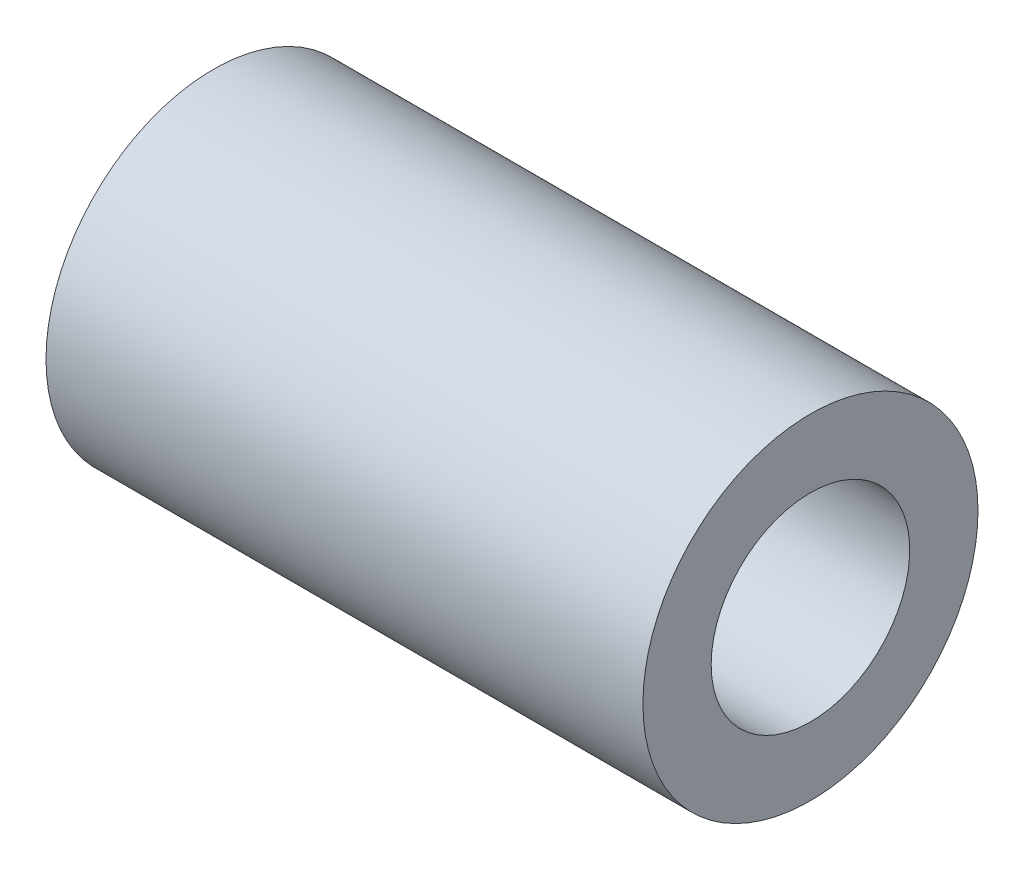
ISO-10303-21;
HEADER;
FILE_DESCRIPTION(('STEP AP214'),'2;1');
FILE_NAME('part.step','',(''),(''),'','','');
FILE_SCHEMA(('AUTOMOTIVE_DESIGN { 1 0 10303 214 1 1 1 1 }'));
ENDSEC;
DATA;
#1=APPLICATION_CONTEXT('core data for automotive mechanical design processes');
#2=APPLICATION_PROTOCOL_DEFINITION('international standard','automotive_design',2000,#1);
#3=PRODUCT_CONTEXT('',#1,'mechanical');
#4=PRODUCT('Part','Part','',(#3));
#5=PRODUCT_RELATED_PRODUCT_CATEGORY('part','',(#4));
#6=PRODUCT_DEFINITION_FORMATION('','',#4);
#7=PRODUCT_DEFINITION_CONTEXT('part definition',#1,'design');
#8=PRODUCT_DEFINITION('design','',#6,#7);
#9=PRODUCT_DEFINITION_SHAPE('','',#8);
#10=(LENGTH_UNIT() NAMED_UNIT(*) SI_UNIT(.MILLI.,.METRE.));
#11=(NAMED_UNIT(*) PLANE_ANGLE_UNIT() SI_UNIT($,.RADIAN.));
#12=(NAMED_UNIT(*) SI_UNIT($,.STERADIAN.) SOLID_ANGLE_UNIT());
#13=UNCERTAINTY_MEASURE_WITH_UNIT(LENGTH_MEASURE(1.E-05),#10,'distance_accuracy_value','');
#14=(GEOMETRIC_REPRESENTATION_CONTEXT(3) GLOBAL_UNCERTAINTY_ASSIGNED_CONTEXT((#13)) GLOBAL_UNIT_ASSIGNED_CONTEXT((#10,
#11,#12)) REPRESENTATION_CONTEXT('',''));
#15=CARTESIAN_POINT('',(0.,0.,0.));
#16=DIRECTION('',(0.,0.,1.));
#17=DIRECTION('',(1.,0.,0.));
#18=AXIS2_PLACEMENT_3D('',#15,#16,#17);
#19=CARTESIAN_POINT('',(96.2,0.,0.));
#20=DIRECTION('',(1.,0.,0.));
#21=DIRECTION('',(0.,0.,-1.));
#22=AXIS2_PLACEMENT_3D('',#19,#20,#21);
#23=PLANE('',#22);
#24=CARTESIAN_POINT('',(96.2,0.,0.));
#25=DIRECTION('',(1.,0.,0.));
#26=DIRECTION('',(0.,0.,-1.));
#27=AXIS2_PLACEMENT_3D('',#24,#25,#26);
#28=CIRCLE('',#27,27.);
#29=CARTESIAN_POINT('',(96.2,0.,27.));
#30=VERTEX_POINT('',#29);
#31=EDGE_CURVE('E10',#30,#30,#28,.T.);
#32=ORIENTED_EDGE('',*,*,#31,.T.);
#33=EDGE_LOOP('',(#32));
#34=FACE_BOUND('',#33,.T.);
#35=CARTESIAN_POINT('',(96.2,0.,0.));
#36=DIRECTION('',(1.,0.,0.));
#37=DIRECTION('',(0.,0.,-1.));
#38=AXIS2_PLACEMENT_3D('',#35,#36,#37);
#39=CIRCLE('',#38,16.);
#40=CARTESIAN_POINT('',(96.2,0.,16.));
#41=VERTEX_POINT('',#40);
#42=EDGE_CURVE('E50',#41,#41,#39,.T.);
#43=ORIENTED_EDGE('',*,*,#42,.F.);
#44=EDGE_LOOP('',(#43));
#45=FACE_BOUND('',#44,.T.);
#46=ADVANCED_FACE('F37',(#34,#45),#23,.T.);
#47=CARTESIAN_POINT('',(0.,0.,0.));
#48=DIRECTION('',(1.,0.,0.));
#49=DIRECTION('',(0.,0.,-1.));
#50=AXIS2_PLACEMENT_3D('',#47,#48,#49);
#51=PLANE('',#50);
#52=CARTESIAN_POINT('',(0.,0.,0.));
#53=DIRECTION('',(1.,0.,0.));
#54=DIRECTION('',(0.,0.,-1.));
#55=AXIS2_PLACEMENT_3D('',#52,#53,#54);
#56=CIRCLE('',#55,27.);
#57=CARTESIAN_POINT('',(0.,0.,27.));
#58=VERTEX_POINT('',#57);
#59=EDGE_CURVE('E41',#58,#58,#56,.T.);
#60=ORIENTED_EDGE('',*,*,#59,.F.);
#61=EDGE_LOOP('',(#60));
#62=FACE_BOUND('',#61,.T.);
#63=CARTESIAN_POINT('',(0.,0.,0.));
#64=DIRECTION('',(1.,0.,0.));
#65=DIRECTION('',(0.,0.,-1.));
#66=AXIS2_PLACEMENT_3D('',#63,#64,#65);
#67=CIRCLE('',#66,16.);
#68=CARTESIAN_POINT('',(0.,0.,16.));
#69=VERTEX_POINT('',#68);
#70=EDGE_CURVE('E52',#69,#69,#67,.T.);
#71=ORIENTED_EDGE('',*,*,#70,.T.);
#72=EDGE_LOOP('',(#71));
#73=FACE_BOUND('',#72,.T.);
#74=ADVANCED_FACE('F64',(#62,#73),#51,.F.);
#75=CARTESIAN_POINT('',(96.2,0.,0.));
#76=DIRECTION('',(-1.,0.,0.));
#77=DIRECTION('',(0.,0.,1.));
#78=AXIS2_PLACEMENT_3D('',#75,#76,#77);
#79=CYLINDRICAL_SURFACE('',#78,27.);
#80=CARTESIAN_POINT('',(96.2,0.,27.));
#81=CARTESIAN_POINT('',(95.1979166666667,0.,27.));
#82=CARTESIAN_POINT('',(94.1958333333333,0.,27.));
#83=CARTESIAN_POINT('',(92.1916666666667,0.,27.));
#84=CARTESIAN_POINT('',(91.1895833333333,0.,27.));
#85=CARTESIAN_POINT('',(89.1854166666667,0.,27.));
#86=CARTESIAN_POINT('',(88.1833333333333,0.,27.));
#87=CARTESIAN_POINT('',(86.1791666666667,0.,27.));
#88=CARTESIAN_POINT('',(85.1770833333333,0.,27.));
#89=CARTESIAN_POINT('',(83.1729166666667,0.,27.));
#90=CARTESIAN_POINT('',(82.1708333333333,0.,27.));
#91=CARTESIAN_POINT('',(80.1666666666667,0.,27.));
#92=CARTESIAN_POINT('',(79.1645833333333,0.,27.));
#93=CARTESIAN_POINT('',(77.1604166666667,0.,27.));
#94=CARTESIAN_POINT('',(76.1583333333333,0.,27.));
#95=CARTESIAN_POINT('',(74.1541666666667,0.,27.));
#96=CARTESIAN_POINT('',(73.1520833333333,0.,27.));
#97=CARTESIAN_POINT('',(71.1479166666667,0.,27.));
#98=CARTESIAN_POINT('',(70.1458333333333,0.,27.));
#99=CARTESIAN_POINT('',(68.1416666666667,0.,27.));
#100=CARTESIAN_POINT('',(67.1395833333333,0.,27.));
#101=CARTESIAN_POINT('',(65.1354166666667,0.,27.));
#102=CARTESIAN_POINT('',(64.1333333333333,0.,27.));
#103=CARTESIAN_POINT('',(62.1291666666667,0.,27.));
#104=CARTESIAN_POINT('',(61.1270833333333,0.,27.));
#105=CARTESIAN_POINT('',(59.1229166666667,0.,27.));
#106=CARTESIAN_POINT('',(58.1208333333333,0.,27.));
#107=CARTESIAN_POINT('',(56.1166666666667,0.,27.));
#108=CARTESIAN_POINT('',(55.1145833333333,0.,27.));
#109=CARTESIAN_POINT('',(53.1104166666667,0.,27.));
#110=CARTESIAN_POINT('',(52.1083333333333,0.,27.));
#111=CARTESIAN_POINT('',(50.1041666666667,0.,27.));
#112=CARTESIAN_POINT('',(49.1020833333333,0.,27.));
#113=CARTESIAN_POINT('',(47.0979166666667,0.,27.));
#114=CARTESIAN_POINT('',(46.0958333333333,0.,27.));
#115=CARTESIAN_POINT('',(44.0916666666667,0.,27.));
#116=CARTESIAN_POINT('',(43.0895833333333,0.,27.));
#117=CARTESIAN_POINT('',(41.0854166666667,0.,27.));
#118=CARTESIAN_POINT('',(40.0833333333333,0.,27.));
#119=CARTESIAN_POINT('',(38.0791666666667,0.,27.));
#120=CARTESIAN_POINT('',(37.0770833333333,0.,27.));
#121=CARTESIAN_POINT('',(35.0729166666667,0.,27.));
#122=CARTESIAN_POINT('',(34.0708333333333,0.,27.));
#123=CARTESIAN_POINT('',(32.0666666666667,0.,27.));
#124=CARTESIAN_POINT('',(31.0645833333333,0.,27.));
#125=CARTESIAN_POINT('',(29.0604166666667,0.,27.));
#126=CARTESIAN_POINT('',(28.0583333333333,0.,27.));
#127=CARTESIAN_POINT('',(26.0541666666667,0.,27.));
#128=CARTESIAN_POINT('',(25.0520833333333,0.,27.));
#129=CARTESIAN_POINT('',(23.0479166666667,0.,27.));
#130=CARTESIAN_POINT('',(22.0458333333333,0.,27.));
#131=CARTESIAN_POINT('',(20.0416666666667,0.,27.));
#132=CARTESIAN_POINT('',(19.0395833333333,0.,27.));
#133=CARTESIAN_POINT('',(17.0354166666667,0.,27.));
#134=CARTESIAN_POINT('',(16.0333333333333,0.,27.));
#135=CARTESIAN_POINT('',(14.0291666666667,0.,27.));
#136=CARTESIAN_POINT('',(13.0270833333333,0.,27.));
#137=CARTESIAN_POINT('',(11.0229166666667,0.,27.));
#138=CARTESIAN_POINT('',(10.0208333333333,0.,27.));
#139=CARTESIAN_POINT('',(8.01666666666666,0.,27.));
#140=CARTESIAN_POINT('',(7.01458333333332,0.,27.));
#141=CARTESIAN_POINT('',(5.01041666666666,0.,27.));
#142=CARTESIAN_POINT('',(4.00833333333332,0.,27.));
#143=CARTESIAN_POINT('',(2.00416666666665,0.,27.));
#144=CARTESIAN_POINT('',(1.00208333333332,0.,27.));
#145=CARTESIAN_POINT('',(0.,0.,27.));
#146=B_SPLINE_CURVE_WITH_KNOTS('',3,(#80,#81,#82,#83,#84,#85,#86,#87,#88,#89,#90,#91,#92,#93,
#94,#95,#96,#97,#98,#99,#100,#101,#102,#103,#104,#105,#106,#107,#108,#109,#110,#111,#112,#113,
#114,#115,#116,#117,#118,#119,#120,#121,#122,#123,#124,#125,#126,#127,#128,#129,#130,#131,#132,
#133,#134,#135,#136,#137,#138,#139,#140,#141,#142,#143,#144,#145),.UNSPECIFIED.,.F.,.F.,(4,2,2,
2,2,2,2,2,2,2,2,2,2,2,2,2,2,2,2,2,2,2,2,2,2,2,2,2,2,2,2,2,4),(0.,3.00625,6.0125,
9.01875000000001,12.025,15.03125,18.0375,21.04375,24.05,27.05625,30.0625,33.06875,36.075,
39.08125,42.0875,45.09375,48.1,51.10625,54.1125,57.11875,60.125,63.13125,66.1375,69.14375,72.15,
75.15625,78.1625,81.16875,84.175,87.18125,90.1875,93.19375,96.2),.UNSPECIFIED.);
#147=EDGE_CURVE('BSEAM39',#30,#58,#146,.T.);
#148=ORIENTED_EDGE('',*,*,#31,.F.);
#149=ORIENTED_EDGE('',*,*,#59,.T.);
#150=ORIENTED_EDGE('',*,*,#147,.T.);
#151=ORIENTED_EDGE('',*,*,#147,.F.);
#152=EDGE_LOOP('',(#148,#150,#149,#151));
#153=FACE_BOUND('',#152,.T.);
#154=ADVANCED_FACE('F39',(#153),#79,.T.);
#155=CARTESIAN_POINT('',(96.2,0.,0.));
#156=DIRECTION('',(-1.,0.,0.));
#157=DIRECTION('',(0.,0.,1.));
#158=AXIS2_PLACEMENT_3D('',#155,#156,#157);
#159=CYLINDRICAL_SURFACE('',#158,16.);
#160=CARTESIAN_POINT('',(96.2,0.,16.));
#161=CARTESIAN_POINT('',(95.1979166666667,0.,16.));
#162=CARTESIAN_POINT('',(94.1958333333333,0.,16.));
#163=CARTESIAN_POINT('',(92.1916666666667,0.,16.));
#164=CARTESIAN_POINT('',(91.1895833333333,0.,16.));
#165=CARTESIAN_POINT('',(89.1854166666667,0.,16.));
#166=CARTESIAN_POINT('',(88.1833333333333,0.,16.));
#167=CARTESIAN_POINT('',(86.1791666666667,0.,16.));
#168=CARTESIAN_POINT('',(85.1770833333333,0.,16.));
#169=CARTESIAN_POINT('',(83.1729166666667,0.,16.));
#170=CARTESIAN_POINT('',(82.1708333333333,0.,16.));
#171=CARTESIAN_POINT('',(80.1666666666667,0.,16.));
#172=CARTESIAN_POINT('',(79.1645833333333,0.,16.));
#173=CARTESIAN_POINT('',(77.1604166666667,0.,16.));
#174=CARTESIAN_POINT('',(76.1583333333333,0.,16.));
#175=CARTESIAN_POINT('',(74.1541666666667,0.,16.));
#176=CARTESIAN_POINT('',(73.1520833333333,0.,16.));
#177=CARTESIAN_POINT('',(71.1479166666667,0.,16.));
#178=CARTESIAN_POINT('',(70.1458333333333,0.,16.));
#179=CARTESIAN_POINT('',(68.1416666666667,0.,16.));
#180=CARTESIAN_POINT('',(67.1395833333333,0.,16.));
#181=CARTESIAN_POINT('',(65.1354166666667,0.,16.));
#182=CARTESIAN_POINT('',(64.1333333333333,0.,16.));
#183=CARTESIAN_POINT('',(62.1291666666667,0.,16.));
#184=CARTESIAN_POINT('',(61.1270833333333,0.,16.));
#185=CARTESIAN_POINT('',(59.1229166666667,0.,16.));
#186=CARTESIAN_POINT('',(58.1208333333333,0.,16.));
#187=CARTESIAN_POINT('',(56.1166666666667,0.,16.));
#188=CARTESIAN_POINT('',(55.1145833333333,0.,16.));
#189=CARTESIAN_POINT('',(53.1104166666667,0.,16.));
#190=CARTESIAN_POINT('',(52.1083333333333,0.,16.));
#191=CARTESIAN_POINT('',(50.1041666666667,0.,16.));
#192=CARTESIAN_POINT('',(49.1020833333333,0.,16.));
#193=CARTESIAN_POINT('',(47.0979166666667,0.,16.));
#194=CARTESIAN_POINT('',(46.0958333333333,0.,16.));
#195=CARTESIAN_POINT('',(44.0916666666667,0.,16.));
#196=CARTESIAN_POINT('',(43.0895833333333,0.,16.));
#197=CARTESIAN_POINT('',(41.0854166666667,0.,16.));
#198=CARTESIAN_POINT('',(40.0833333333333,0.,16.));
#199=CARTESIAN_POINT('',(38.0791666666667,0.,16.));
#200=CARTESIAN_POINT('',(37.0770833333333,0.,16.));
#201=CARTESIAN_POINT('',(35.0729166666667,0.,16.));
#202=CARTESIAN_POINT('',(34.0708333333333,0.,16.));
#203=CARTESIAN_POINT('',(32.0666666666667,0.,16.));
#204=CARTESIAN_POINT('',(31.0645833333333,0.,16.));
#205=CARTESIAN_POINT('',(29.0604166666667,0.,16.));
#206=CARTESIAN_POINT('',(28.0583333333333,0.,16.));
#207=CARTESIAN_POINT('',(26.0541666666667,0.,16.));
#208=CARTESIAN_POINT('',(25.0520833333333,0.,16.));
#209=CARTESIAN_POINT('',(23.0479166666667,0.,16.));
#210=CARTESIAN_POINT('',(22.0458333333333,0.,16.));
#211=CARTESIAN_POINT('',(20.0416666666667,0.,16.));
#212=CARTESIAN_POINT('',(19.0395833333333,0.,16.));
#213=CARTESIAN_POINT('',(17.0354166666667,0.,16.));
#214=CARTESIAN_POINT('',(16.0333333333333,0.,16.));
#215=CARTESIAN_POINT('',(14.0291666666667,0.,16.));
#216=CARTESIAN_POINT('',(13.0270833333333,0.,16.));
#217=CARTESIAN_POINT('',(11.0229166666667,0.,16.));
#218=CARTESIAN_POINT('',(10.0208333333333,0.,16.));
#219=CARTESIAN_POINT('',(8.01666666666666,0.,16.));
#220=CARTESIAN_POINT('',(7.01458333333332,0.,16.));
#221=CARTESIAN_POINT('',(5.01041666666666,0.,16.));
#222=CARTESIAN_POINT('',(4.00833333333332,0.,16.));
#223=CARTESIAN_POINT('',(2.00416666666665,0.,16.));
#224=CARTESIAN_POINT('',(1.00208333333332,0.,16.));
#225=CARTESIAN_POINT('',(0.,0.,16.));
#226=B_SPLINE_CURVE_WITH_KNOTS('',3,(#160,#161,#162,#163,#164,#165,#166,#167,#168,#169,#170,
#171,#172,#173,#174,#175,#176,#177,#178,#179,#180,#181,#182,#183,#184,#185,#186,#187,#188,#189,
#190,#191,#192,#193,#194,#195,#196,#197,#198,#199,#200,#201,#202,#203,#204,#205,#206,#207,#208,
#209,#210,#211,#212,#213,#214,#215,#216,#217,#218,#219,#220,#221,#222,#223,#224,#225),
.UNSPECIFIED.,.F.,.F.,(4,2,2,2,2,2,2,2,2,2,2,2,2,2,2,2,2,2,2,2,2,2,2,2,2,2,2,2,2,2,2,2,4),(0.,
3.00625,6.0125,9.01875000000001,12.025,15.03125,18.0375,21.04375,24.05,27.05625,30.0625,
33.06875,36.075,39.08125,42.0875,45.09375,48.1,51.10625,54.1125,57.11875,60.125,63.13125,
66.1375,69.14375,72.15,75.15625,78.1625,81.16875,84.175,87.18125,90.1875,93.19375,96.2),.UNSPECIFIED.);
#227=EDGE_CURVE('BSEAM60',#41,#69,#226,.T.);
#228=ORIENTED_EDGE('',*,*,#42,.T.);
#229=ORIENTED_EDGE('',*,*,#70,.F.);
#230=ORIENTED_EDGE('',*,*,#227,.T.);
#231=ORIENTED_EDGE('',*,*,#227,.F.);
#232=EDGE_LOOP('',(#228,#230,#229,#231));
#233=FACE_BOUND('',#232,.T.);
#234=ADVANCED_FACE('F60',(#233),#159,.F.);
#235=CLOSED_SHELL('',(#46,#74,#154,#234));
#236=MANIFOLD_SOLID_BREP('B2',#235);
#237=ADVANCED_BREP_SHAPE_REPRESENTATION('',(#18,#236),#14);
#238=SHAPE_DEFINITION_REPRESENTATION(#9,#237);
ENDSEC;
END-ISO-10303-21;
